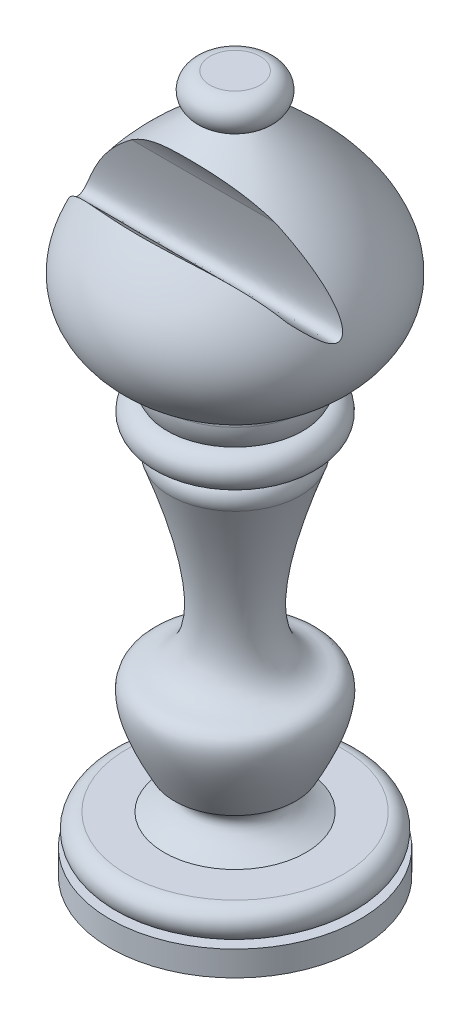
ISO-10303-21;
HEADER;
FILE_DESCRIPTION(('STEP AP214'),'2;1');
FILE_NAME('part.step','',(''),(''),'','','');
FILE_SCHEMA(('AUTOMOTIVE_DESIGN { 1 0 10303 214 1 1 1 1 }'));
ENDSEC;
DATA;
#1=APPLICATION_CONTEXT('core data for automotive mechanical design processes');
#2=APPLICATION_PROTOCOL_DEFINITION('international standard','automotive_design',2000,#1);
#3=PRODUCT_CONTEXT('',#1,'mechanical');
#4=PRODUCT('Part','Part','',(#3));
#5=PRODUCT_RELATED_PRODUCT_CATEGORY('part','',(#4));
#6=PRODUCT_DEFINITION_FORMATION('','',#4);
#7=PRODUCT_DEFINITION_CONTEXT('part definition',#1,'design');
#8=PRODUCT_DEFINITION('design','',#6,#7);
#9=PRODUCT_DEFINITION_SHAPE('','',#8);
#10=(LENGTH_UNIT() NAMED_UNIT(*) SI_UNIT(.MILLI.,.METRE.));
#11=(NAMED_UNIT(*) PLANE_ANGLE_UNIT() SI_UNIT($,.RADIAN.));
#12=(NAMED_UNIT(*) SI_UNIT($,.STERADIAN.) SOLID_ANGLE_UNIT());
#13=UNCERTAINTY_MEASURE_WITH_UNIT(LENGTH_MEASURE(1.E-05),#10,'distance_accuracy_value','');
#14=(GEOMETRIC_REPRESENTATION_CONTEXT(3) GLOBAL_UNCERTAINTY_ASSIGNED_CONTEXT((#13)) GLOBAL_UNIT_ASSIGNED_CONTEXT((#10,
#11,#12)) REPRESENTATION_CONTEXT('',''));
#15=CARTESIAN_POINT('',(0.,0.,0.));
#16=DIRECTION('',(0.,0.,1.));
#17=DIRECTION('',(1.,0.,0.));
#18=AXIS2_PLACEMENT_3D('',#15,#16,#17);
#19=CARTESIAN_POINT('',(0.,3.,0.));
#20=DIRECTION('',(0.,-1.,0.));
#21=DIRECTION('',(0.,0.,-1.));
#22=AXIS2_PLACEMENT_3D('',#19,#20,#21);
#23=CYLINDRICAL_SURFACE('',#22,15.);
#24=CARTESIAN_POINT('',(0.,3.,0.));
#25=DIRECTION('',(0.,1.,0.));
#26=DIRECTION('',(0.,0.,1.));
#27=AXIS2_PLACEMENT_3D('',#24,#25,#26);
#28=CIRCLE('',#27,15.);
#29=CARTESIAN_POINT('',(0.,3.,15.));
#30=VERTEX_POINT('',#29);
#31=EDGE_CURVE('E178',#30,#30,#28,.T.);
#32=ORIENTED_EDGE('',*,*,#31,.F.);
#33=EDGE_LOOP('',(#32));
#34=FACE_BOUND('',#33,.T.);
#35=CARTESIAN_POINT('',(0.,0.,0.));
#36=DIRECTION('',(0.,1.,0.));
#37=DIRECTION('',(0.,0.,1.));
#38=AXIS2_PLACEMENT_3D('',#35,#36,#37);
#39=CIRCLE('',#38,15.);
#40=CARTESIAN_POINT('',(0.,0.,15.));
#41=VERTEX_POINT('',#40);
#42=EDGE_CURVE('E177',#41,#41,#39,.T.);
#43=ORIENTED_EDGE('',*,*,#42,.T.);
#44=EDGE_LOOP('',(#43));
#45=FACE_BOUND('',#44,.T.);
#46=ADVANCED_FACE('F36',(#34,#45),#23,.T.);
#47=CARTESIAN_POINT('',(0.,3.,0.));
#48=DIRECTION('',(0.,1.,0.));
#49=DIRECTION('',(0.,0.,1.));
#50=AXIS2_PLACEMENT_3D('',#47,#48,#49);
#51=PLANE('',#50);
#52=CARTESIAN_POINT('',(0.,3.,0.));
#53=DIRECTION('',(0.,-1.,0.));
#54=DIRECTION('',(1.,0.,0.));
#55=AXIS2_PLACEMENT_3D('',#52,#53,#54);
#56=CIRCLE('',#55,13.);
#57=CARTESIAN_POINT('',(13.,3.,0.));
#58=VERTEX_POINT('',#57);
#59=EDGE_CURVE('E165',#58,#58,#56,.T.);
#60=ORIENTED_EDGE('',*,*,#59,.T.);
#61=EDGE_LOOP('',(#60));
#62=FACE_BOUND('',#61,.T.);
#63=ORIENTED_EDGE('',*,*,#31,.T.);
#64=EDGE_LOOP('',(#63));
#65=FACE_BOUND('',#64,.T.);
#66=ADVANCED_FACE('F196',(#62,#65),#51,.T.);
#67=CARTESIAN_POINT('',(0.,0.,0.));
#68=DIRECTION('',(0.,1.,0.));
#69=DIRECTION('',(0.,0.,1.));
#70=AXIS2_PLACEMENT_3D('',#67,#68,#69);
#71=PLANE('',#70);
#72=ORIENTED_EDGE('',*,*,#42,.F.);
#73=EDGE_LOOP('',(#72));
#74=FACE_BOUND('',#73,.T.);
#75=ADVANCED_FACE('F193',(#74),#71,.F.);
#76=CARTESIAN_POINT('',(0.,4.83640551469907,0.));
#77=DIRECTION('',(0.,-1.,0.));
#78=DIRECTION('',(1.,0.,0.));
#79=AXIS2_PLACEMENT_3D('',#76,#77,#78);
#80=TOROIDAL_SURFACE('',#79,13.,1.83640551469907);
#81=CARTESIAN_POINT('',(0.,6.67281102939814,0.));
#82=DIRECTION('',(0.,-1.,0.));
#83=DIRECTION('',(1.,0.,0.));
#84=AXIS2_PLACEMENT_3D('',#81,#82,#83);
#85=CIRCLE('',#84,13.);
#86=CARTESIAN_POINT('',(13.,6.67281102939813,0.));
#87=VERTEX_POINT('',#86);
#88=EDGE_CURVE('E174',#87,#87,#85,.T.);
#89=ORIENTED_EDGE('',*,*,#88,.T.);
#90=EDGE_LOOP('',(#89));
#91=FACE_BOUND('',#90,.T.);
#92=ORIENTED_EDGE('',*,*,#59,.F.);
#93=EDGE_LOOP('',(#92));
#94=FACE_BOUND('',#93,.T.);
#95=ADVANCED_FACE('F195',(#91,#94),#80,.T.);
#96=CARTESIAN_POINT('',(13.,6.67281102939813,0.));
#97=DIRECTION('',(0.,1.,0.));
#98=DIRECTION('',(-1.,0.,0.));
#99=AXIS2_PLACEMENT_3D('',#96,#97,#98);
#100=PLANE('',#99);
#101=CARTESIAN_POINT('',(0.,6.67281102939813,0.));
#102=DIRECTION('',(0.,-1.,0.));
#103=DIRECTION('',(1.,0.,0.));
#104=AXIS2_PLACEMENT_3D('',#101,#102,#103);
#105=CIRCLE('',#104,8.49943361059358);
#106=CARTESIAN_POINT('',(8.49943361059358,6.67281102939813,0.));
#107=VERTEX_POINT('',#106);
#108=EDGE_CURVE('E171',#107,#107,#105,.T.);
#109=ORIENTED_EDGE('',*,*,#108,.T.);
#110=EDGE_LOOP('',(#109));
#111=FACE_BOUND('',#110,.T.);
#112=ORIENTED_EDGE('',*,*,#88,.F.);
#113=EDGE_LOOP('',(#112));
#114=FACE_BOUND('',#113,.T.);
#115=ADVANCED_FACE('F155',(#111,#114),#100,.T.);
#116=CARTESIAN_POINT('',(8.49943361059358,6.67281102939813,0.));
#117=CARTESIAN_POINT('',(2.78255118880664,9.10264856484603,0.));
#118=CARTESIAN_POINT('',(7.27414037229584,11.4072276424758,0.));
#119=B_SPLINE_CURVE_WITH_KNOTS('',2,(#116,#117,#118),.UNSPECIFIED.,.F.,.F.,(3,3),(0.,1.),.UNSPECIFIED.);
#120=CARTESIAN_POINT('',(0.,0.,0.));
#121=DIRECTION('',(0.,-1.,0.));
#122=AXIS1_PLACEMENT('',#120,#121);
#123=SURFACE_OF_REVOLUTION('',#119,#122);
#124=CARTESIAN_POINT('',(0.,11.4072276424758,0.));
#125=DIRECTION('',(0.,-1.,0.));
#126=DIRECTION('',(0.,0.,-1.));
#127=AXIS2_PLACEMENT_3D('',#124,#125,#126);
#128=CIRCLE('',#127,7.27414037229584);
#129=CARTESIAN_POINT('',(0.,11.4072276424758,-7.27414037229584));
#130=VERTEX_POINT('',#129);
#131=EDGE_CURVE('E163',#130,#130,#128,.T.);
#132=ORIENTED_EDGE('',*,*,#131,.T.);
#133=EDGE_LOOP('',(#132));
#134=FACE_BOUND('',#133,.T.);
#135=ORIENTED_EDGE('',*,*,#108,.F.);
#136=EDGE_LOOP('',(#135));
#137=FACE_BOUND('',#136,.T.);
#138=ADVANCED_FACE('F149',(#134,#137),#123,.F.);
#139=CARTESIAN_POINT('',(7.27414037229584,11.4072276424758,0.));
#140=CARTESIAN_POINT('',(12.4321611006904,20.9437745175261,0.));
#141=CARTESIAN_POINT('',(0.485845427921329,23.2013122271752,0.));
#142=CARTESIAN_POINT('',(7.82984573011213,43.4167765908085,0.));
#143=B_SPLINE_CURVE_WITH_KNOTS('',2,(#139,#140,#141,#142),.UNSPECIFIED.,.F.,.F.,(3,1,3),(0.,
0.339914942208554,1.),.UNSPECIFIED.);
#144=CARTESIAN_POINT('',(0.,0.,0.));
#145=DIRECTION('',(0.,-1.,0.));
#146=AXIS1_PLACEMENT('',#144,#145);
#147=SURFACE_OF_REVOLUTION('',#143,#146);
#148=CARTESIAN_POINT('',(0.,43.4167765908085,0.));
#149=DIRECTION('',(0.,-1.,0.));
#150=DIRECTION('',(0.,0.,-1.));
#151=AXIS2_PLACEMENT_3D('',#148,#149,#150);
#152=CIRCLE('',#151,7.82984573011214);
#153=CARTESIAN_POINT('',(0.,43.4167765908085,-7.82984573011214));
#154=VERTEX_POINT('',#153);
#155=EDGE_CURVE('E134',#154,#154,#152,.T.);
#156=ORIENTED_EDGE('',*,*,#155,.T.);
#157=EDGE_LOOP('',(#156));
#158=FACE_BOUND('',#157,.T.);
#159=ORIENTED_EDGE('',*,*,#131,.F.);
#160=EDGE_LOOP('',(#159));
#161=FACE_BOUND('',#160,.T.);
#162=ADVANCED_FACE('F144',(#158,#161),#147,.F.);
#163=CARTESIAN_POINT('',(0.,0.,0.));
#164=DIRECTION('',(0.,-1.,0.));
#165=DIRECTION('',(0.,0.,-1.));
#166=AXIS2_PLACEMENT_3D('',#163,#164,#165);
#167=CYLINDRICAL_SURFACE('',#166,8.82393962345572);
#168=CARTESIAN_POINT('',(0.,52.8435958869309,0.));
#169=DIRECTION('',(0.,-1.,0.));
#170=DIRECTION('',(0.,0.,-1.));
#171=AXIS2_PLACEMENT_3D('',#168,#169,#170);
#172=CIRCLE('',#171,8.82393962345572);
#173=CARTESIAN_POINT('',(0.,52.8435958869309,-8.82393962345572));
#174=VERTEX_POINT('',#173);
#175=EDGE_CURVE('E44',#174,#174,#172,.F.);
#176=ORIENTED_EDGE('',*,*,#175,.T.);
#177=EDGE_LOOP('',(#176));
#178=FACE_BOUND('',#177,.T.);
#179=CARTESIAN_POINT('',(0.,53.2850113292567,0.));
#180=DIRECTION('',(0.,-1.,0.));
#181=DIRECTION('',(0.,0.,-1.));
#182=AXIS2_PLACEMENT_3D('',#179,#180,#181);
#183=CIRCLE('',#182,8.82393962345572);
#184=CARTESIAN_POINT('',(0.,53.2850113292567,-8.82393962345572));
#185=VERTEX_POINT('',#184);
#186=EDGE_CURVE('E73',#185,#185,#183,.T.);
#187=ORIENTED_EDGE('',*,*,#186,.T.);
#188=EDGE_LOOP('',(#187));
#189=FACE_BOUND('',#188,.T.);
#190=ADVANCED_FACE('F148',(#178,#189),#167,.T.);
#191=CARTESIAN_POINT('',(0.,48.2960300306177,0.));
#192=DIRECTION('',(0.,-1.,0.));
#193=DIRECTION('',(0.,0.,-1.));
#194=AXIS2_PLACEMENT_3D('',#191,#192,#193);
#195=TOROIDAL_SURFACE('',#194,8.12625390855244,2.00000000000001);
#196=CARTESIAN_POINT('',(0.,50.2960300306177,0.));
#197=DIRECTION('',(0.,-1.,0.));
#198=DIRECTION('',(0.,0.,-1.));
#199=AXIS2_PLACEMENT_3D('',#196,#197,#198);
#200=CIRCLE('',#199,8.12625390855244);
#201=CARTESIAN_POINT('',(0.,50.2960300306177,-8.12625390855244));
#202=VERTEX_POINT('',#201);
#203=EDGE_CURVE('E371',#202,#202,#200,.T.);
#204=ORIENTED_EDGE('',*,*,#203,.T.);
#205=EDGE_LOOP('',(#204));
#206=FACE_BOUND('',#205,.T.);
#207=CARTESIAN_POINT('',(0.,46.2960300306177,0.));
#208=DIRECTION('',(0.,-1.,0.));
#209=DIRECTION('',(0.,0.,-1.));
#210=AXIS2_PLACEMENT_3D('',#207,#208,#209);
#211=CIRCLE('',#210,8.12625390855244);
#212=CARTESIAN_POINT('',(0.,46.2960300306177,-8.12625390855244));
#213=VERTEX_POINT('',#212);
#214=EDGE_CURVE('E372',#213,#213,#211,.T.);
#215=ORIENTED_EDGE('',*,*,#214,.F.);
#216=EDGE_LOOP('',(#215));
#217=FACE_BOUND('',#216,.T.);
#218=ADVANCED_FACE('F250',(#206,#217),#195,.T.);
#219=CARTESIAN_POINT('',(6.03348457806508,46.2960300306177,0.));
#220=DIRECTION('',(0.,-1.,0.));
#221=DIRECTION('',(0.,0.,-1.));
#222=AXIS2_PLACEMENT_3D('',#219,#220,#221);
#223=PLANE('',#222);
#224=ORIENTED_EDGE('',*,*,#214,.T.);
#225=EDGE_LOOP('',(#224));
#226=FACE_BOUND('',#225,.T.);
#227=CARTESIAN_POINT('',(0.,46.2960300306177,0.));
#228=DIRECTION('',(0.,-1.,0.));
#229=DIRECTION('',(0.,0.,-1.));
#230=AXIS2_PLACEMENT_3D('',#227,#228,#229);
#231=CIRCLE('',#230,6.03348457806508);
#232=CARTESIAN_POINT('',(0.,46.2960300306177,-6.03348457806508));
#233=VERTEX_POINT('',#232);
#234=EDGE_CURVE('E375',#233,#233,#231,.T.);
#235=ORIENTED_EDGE('',*,*,#234,.F.);
#236=EDGE_LOOP('',(#235));
#237=FACE_BOUND('',#236,.T.);
#238=ADVANCED_FACE('F256',(#226,#237),#223,.T.);
#239=CARTESIAN_POINT('',(0.,44.2960300306177,0.));
#240=DIRECTION('',(0.,-1.,0.));
#241=DIRECTION('',(0.,0.,-1.));
#242=AXIS2_PLACEMENT_3D('',#239,#240,#241);
#243=TOROIDAL_SURFACE('',#242,6.03348457806508,2.);
#244=ORIENTED_EDGE('',*,*,#234,.T.);
#245=EDGE_LOOP('',(#244));
#246=FACE_BOUND('',#245,.T.);
#247=ORIENTED_EDGE('',*,*,#155,.F.);
#248=EDGE_LOOP('',(#247));
#249=FACE_BOUND('',#248,.T.);
#250=ADVANCED_FACE('F266',(#246,#249),#243,.T.);
#251=CARTESIAN_POINT('',(0.,53.2850113292567,-8.82393962345572));
#252=CARTESIAN_POINT('',(0.,63.283858911102,-26.7596708130507));
#253=CARTESIAN_POINT('',(0.,81.5387323526658,0.));
#254=B_SPLINE_CURVE_WITH_KNOTS('',2,(#251,#252,#253),.UNSPECIFIED.,.F.,.F.,(3,3),(0.,1.),.UNSPECIFIED.);
#255=CARTESIAN_POINT('',(0.,53.2850113292567,0.));
#256=DIRECTION('',(0.,-1.,0.));
#257=AXIS1_PLACEMENT('',#255,#256);
#258=SURFACE_OF_REVOLUTION('',#254,#257);
#259=CARTESIAN_POINT('',(0.,79.6703288943434,0.));
#260=DIRECTION('',(0.,-1.,0.));
#261=DIRECTION('',(0.,0.,-1.));
#262=AXIS2_PLACEMENT_3D('',#259,#260,#261);
#263=CIRCLE('',#262,2.65148413658831);
#264=CARTESIAN_POINT('',(0.,79.6703288943434,-2.65148413658831));
#265=VERTEX_POINT('',#264);
#266=EDGE_CURVE('E11',#265,#265,#263,.F.);
#267=ORIENTED_EDGE('',*,*,#266,.F.);
#268=EDGE_LOOP('',(#267));
#269=FACE_BOUND('',#268,.T.);
#270=CARTESIAN_POINT('',(-8.60792510163417,74.0978234508581,3.80757069284475));
#271=CARTESIAN_POINT('',(-8.72442885410751,74.005631653139,3.78175795430837));
#272=CARTESIAN_POINT('',(-8.84020421720979,73.9125479341612,3.7558445667934));
#273=CARTESIAN_POINT('',(-9.07028086226353,73.724622452141,3.7038579505274));
#274=CARTESIAN_POINT('',(-9.18458215942401,73.6297807072621,3.67778472342965));
#275=CARTESIAN_POINT('',(-9.4116950107282,73.4383637126611,3.62551952624832));
#276=CARTESIAN_POINT('',(-9.52450657491791,73.3417884746392,3.59932755696707));
#277=CARTESIAN_POINT('',(-9.7493515199577,73.1462738106939,3.54669371530906));
#278=CARTESIAN_POINT('',(-9.86137488571513,73.0473230047954,3.52025133302029));
#279=CARTESIAN_POINT('',(-10.0838515317509,72.8476777153758,3.46733199261382));
#280=CARTESIAN_POINT('',(-10.1943047970652,72.7469832152566,3.44085503416921));
#281=CARTESIAN_POINT('',(-10.4135957924079,72.5438434589893,3.38791361101796));
#282=CARTESIAN_POINT('',(-10.5224334786861,72.4413981555903,3.36144914666838));
#283=CARTESIAN_POINT('',(-10.8622619957894,72.1162848789113,3.27827676291813));
#284=CARTESIAN_POINT('',(-11.0902508446968,71.8904308762382,3.22167828300116));
#285=CARTESIAN_POINT('',(-11.5378891370659,71.4302960999678,3.10933862263057));
#286=CARTESIAN_POINT('',(-11.7575367365424,71.1960134851082,3.05359763334255));
#287=CARTESIAN_POINT('',(-12.1876324529455,70.7184815218298,2.94372832184705));
#288=CARTESIAN_POINT('',(-12.3980746624152,70.4752265948434,2.88960104211313));
#289=CARTESIAN_POINT('',(-12.8076284904951,69.9801728278719,2.7843035864601));
#290=CARTESIAN_POINT('',(-13.0067767181597,69.7284063838464,2.73312384668777));
#291=CARTESIAN_POINT('',(-13.392789251236,69.2149138504356,2.63520909167128));
#292=CARTESIAN_POINT('',(-13.5796598659093,68.9531929873851,2.5884717879285));
#293=CARTESIAN_POINT('',(-13.8490166337107,68.5525864432176,2.52384691200866));
#294=CARTESIAN_POINT('',(-13.936937976498,68.4177796932854,2.50322734278037));
#295=CARTESIAN_POINT('',(-14.1088067868696,68.1453271802574,2.46436498489935));
#296=CARTESIAN_POINT('',(-14.1927547101867,68.0076817453582,2.44612192324961));
#297=CARTESIAN_POINT('',(-14.3403834132286,67.7564381388699,2.41600168081937));
#298=CARTESIAN_POINT('',(-14.4048350562705,67.6433587963072,2.40357620197817));
#299=CARTESIAN_POINT('',(-14.5306197622909,67.4152029991069,2.38130906074969));
#300=CARTESIAN_POINT('',(-14.5919525020299,67.3001263391206,2.3714676657355));
#301=CARTESIAN_POINT('',(-14.7110917174099,67.0680816776525,2.35514855293456));
#302=CARTESIAN_POINT('',(-14.7689020410864,66.9511159233316,2.34866710427529));
#303=CARTESIAN_POINT('',(-14.8806386869285,66.7151915711022,2.34015546564201));
#304=CARTESIAN_POINT('',(-14.9345661745719,66.5962335845112,2.33812393454167));
#305=CARTESIAN_POINT('',(-15.0125179891717,66.4154395370067,2.33972939034757));
#306=CARTESIAN_POINT('',(-15.0382006491714,66.3542952417337,2.34106920814199));
#307=CARTESIAN_POINT('',(-15.0883070381997,66.2315673403049,2.34568528808538));
#308=CARTESIAN_POINT('',(-15.1127309101506,66.1699837849306,2.34896132986725));
#309=CARTESIAN_POINT('',(-15.1602118513219,66.0463900929013,2.35788290957969));
#310=CARTESIAN_POINT('',(-15.1832676111812,65.9843796090186,2.36353067693617));
#311=CARTESIAN_POINT('',(-15.227805785995,65.8601350093043,2.37777926670716));
#312=CARTESIAN_POINT('',(-15.2492886288766,65.7979009591658,2.38637928228494));
#313=CARTESIAN_POINT('',(-15.2837679564817,65.6936105688696,2.40395847266603));
#314=CARTESIAN_POINT('',(-15.2972598084872,65.6515461346667,2.41191306764712));
#315=CARTESIAN_POINT('',(-15.3232978177225,65.5675709113722,2.42989209936333));
#316=CARTESIAN_POINT('',(-15.3358442106962,65.5256600864753,2.43991601777969));
#317=CARTESIAN_POINT('',(-15.3598279232019,65.4422647673878,2.46245050727852));
#318=CARTESIAN_POINT('',(-15.3712671667726,65.4007796498197,2.47495664490577));
#319=CARTESIAN_POINT('',(-15.392853234021,65.3185250185999,2.5030168941858));
#320=CARTESIAN_POINT('',(-15.4030009595538,65.2777550229281,2.51856885948448));
#321=CARTESIAN_POINT('',(-15.4223908289694,65.1946280101569,2.55465035259437));
#322=CARTESIAN_POINT('',(-15.4315196890511,65.1523599744341,2.57545230871912));
#323=CARTESIAN_POINT('',(-15.4474945565152,65.0703787084963,2.6223736884158));
#324=CARTESIAN_POINT('',(-15.4543429582629,65.0306628342372,2.6484874881046));
#325=CARTESIAN_POINT('',(-15.4641034008734,64.9626761974068,2.70147299569622));
#326=CARTESIAN_POINT('',(-15.4675136214293,64.933657969303,2.72727774376412));
#327=CARTESIAN_POINT('',(-15.4720392748044,64.8798846643474,2.7831706018691));
#328=CARTESIAN_POINT('',(-15.4731582942772,64.8551229800448,2.813251938244));
#329=CARTESIAN_POINT('',(-15.4728711462349,64.8110309599236,2.87749909505793));
#330=CARTESIAN_POINT('',(-15.4714473171115,64.7917396987633,2.91169193262561));
#331=CARTESIAN_POINT('',(-15.4660921671221,64.7596382605758,2.98282342703794));
#332=CARTESIAN_POINT('',(-15.4621589594448,64.7468329733852,3.0197641315348));
#333=CARTESIAN_POINT('',(-15.4515179205756,64.7264244310221,3.09950292783943));
#334=CARTESIAN_POINT('',(-15.4445313733679,64.7196407148634,3.14246794199557));
#335=CARTESIAN_POINT('',(-15.4284610521006,64.7128754875067,3.22852237836374));
#336=CARTESIAN_POINT('',(-15.4193738249493,64.7129052568744,3.27161188877752));
#337=CARTESIAN_POINT('',(-15.4013386615881,64.7178579319187,3.34971095193057));
#338=CARTESIAN_POINT('',(-15.3926333326818,64.7219420747691,3.38484061164093));
#339=CARTESIAN_POINT('',(-15.3743673133588,64.7330733022991,3.4544154784901));
#340=CARTESIAN_POINT('',(-15.3648059967464,64.7401225702831,3.48886016164917));
#341=CARTESIAN_POINT('',(-15.3449654974272,64.7566193918004,3.55705255749627));
#342=CARTESIAN_POINT('',(-15.3346844362427,64.7660734045395,3.5907981240765));
#343=CARTESIAN_POINT('',(-15.3135413703151,64.7869089757564,3.6574817698678));
#344=CARTESIAN_POINT('',(-15.3026795316141,64.7982899853076,3.69042007598573));
#345=CARTESIAN_POINT('',(-15.2699931566106,64.8340603410383,3.78616844024638));
#346=CARTESIAN_POINT('',(-15.2474681357549,64.8606151159589,3.84793017212712));
#347=CARTESIAN_POINT('',(-15.2008410692561,64.9178282293605,3.96899403970514));
#348=CARTESIAN_POINT('',(-15.1767362943448,64.9484937707264,4.02829161321123));
#349=CARTESIAN_POINT('',(-15.1271472871379,65.0127924975459,4.14471989432258));
#350=CARTESIAN_POINT('',(-15.1016618962052,65.0464281909951,4.20184871129547));
#351=CARTESIAN_POINT('',(-15.0491978911645,65.1162087162706,4.31470647389394));
#352=CARTESIAN_POINT('',(-15.0222073207913,65.1523744803937,4.37041679012676));
#353=CARTESIAN_POINT('',(-14.9670661212975,65.226337112333,4.48004217161833));
#354=CARTESIAN_POINT('',(-14.9389168213853,65.2641321134378,4.53395917231663));
#355=CARTESIAN_POINT('',(-14.8814940734997,65.340985341291,4.64023450115512));
#356=CARTESIAN_POINT('',(-14.8522209995184,65.3800431471068,4.69259333772927));
#357=CARTESIAN_POINT('',(-14.7745793252497,65.4830124859142,4.82712278249575));
#358=CARTESIAN_POINT('',(-14.7253511079955,65.5476939021984,4.90820905947476));
#359=CARTESIAN_POINT('',(-14.6241887883338,65.6787382763479,5.06736017735435));
#360=CARTESIAN_POINT('',(-14.5722530520766,65.7451022368411,5.145423143146));
#361=CARTESIAN_POINT('',(-14.4657576206099,65.8789491304198,5.29890742237179));
#362=CARTESIAN_POINT('',(-14.4111955306331,65.9464330465171,5.37432621220892));
#363=CARTESIAN_POINT('',(-14.2995400912851,66.082084437904,5.52278089933074));
#364=CARTESIAN_POINT('',(-14.2424446384548,66.1502524434338,5.5958147256141));
#365=CARTESIAN_POINT('',(-14.1258223216752,66.2869282984815,5.73968352957381));
#366=CARTESIAN_POINT('',(-14.0662941816696,66.3554363093572,5.81051731803603));
#367=CARTESIAN_POINT('',(-13.948232977937,66.4887627531436,5.94630226711074));
#368=CARTESIAN_POINT('',(-13.8898230719033,66.5535783857986,6.01136344361497));
#369=CARTESIAN_POINT('',(-13.7710266535849,66.6830580042002,6.13972019550286));
#370=CARTESIAN_POINT('',(-13.7106410966698,66.7477220475013,6.20301659763659));
#371=CARTESIAN_POINT('',(-13.588002766337,66.8767181688121,6.3279002030089));
#372=CARTESIAN_POINT('',(-13.5257522135908,66.9410505424704,6.38948928305912));
#373=CARTESIAN_POINT('',(-13.3994998368498,67.0692230764022,6.5110000536897));
#374=CARTESIAN_POINT('',(-13.3355015317719,67.1330639354803,6.57092466598778));
#375=CARTESIAN_POINT('',(-13.2058750744465,67.2601136592446,6.68913411960582));
#376=CARTESIAN_POINT('',(-13.140251746192,67.3233237586074,6.74742292266363));
#377=CARTESIAN_POINT('',(-13.0737609589204,67.3862588271674,6.80500766579694));
#378=B_SPLINE_CURVE_WITH_KNOTS('',3,(#270,#271,#272,#273,#274,#275,#276,#277,#278,#279,#280,
#281,#282,#283,#284,#285,#286,#287,#288,#289,#290,#291,#292,#293,#294,#295,#296,#297,#298,#299,
#300,#301,#302,#303,#304,#305,#306,#307,#308,#309,#310,#311,#312,#313,#314,#315,#316,#317,#318,
#319,#320,#321,#322,#323,#324,#325,#326,#327,#328,#329,#330,#331,#332,#333,#334,#335,#336,#337,
#338,#339,#340,#341,#342,#343,#344,#345,#346,#347,#348,#349,#350,#351,#352,#353,#354,#355,#356,
#357,#358,#359,#360,#361,#362,#363,#364,#365,#366,#367,#368,#369,#370,#371,#372,#373,#374,#375,
#376,#377),.UNSPECIFIED.,.F.,.F.,(4,2,2,2,2,2,2,2,2,2,2,2,2,2,2,2,2,2,2,2,2,2,2,2,2,2,2,2,2,2,2,
2,2,2,2,2,2,2,2,2,2,2,2,2,2,2,2,2,2,2,2,2,2,4),(0.,0.452376416493641,0.9047481617432,
1.35711685486824,1.81246419500167,2.26781587198794,2.72317985756403,3.70057408930474,
4.67818314874248,5.65641064006031,6.63126093868958,7.60560629503966,8.09231422189479,
8.57896618966111,8.97114845888386,9.36337129091746,9.7551576621578,10.1468259396704,
10.3457914183323,10.544734256533,10.743864521412,10.942940408116,11.0775512710063,
11.2121284577383,11.3464674067754,11.4807120273786,11.6243635343158,11.767863735368,
11.8843654600813,12.0006846727552,12.1178149367047,12.2350333753083,12.3664720964471,
12.4981284321722,12.6072402260587,12.7164325030403,12.8259212288356,12.9353788178563,
13.1478066838804,13.3606117536799,13.5735982664781,13.7886231018021,14.0034077989952,
14.2181216251936,14.5624538596058,14.906996342006,15.2518591677699,15.5970138980097,
15.9423520620095,16.2688331346735,16.5951585982078,16.9211098428393,17.2464472306585,
17.5709133176962),.UNSPECIFIED.);
#379=CARTESIAN_POINT('',(-8.60792510163417,74.0978234508581,3.80757069284475));
#380=VERTEX_POINT('',#379);
#381=CARTESIAN_POINT('',(-13.0737609589204,67.3862588271674,6.80500766579693));
#382=VERTEX_POINT('',#381);
#383=EDGE_CURVE('E56',#380,#382,#378,.T.);
#384=ORIENTED_EDGE('',*,*,#383,.F.);
#385=CARTESIAN_POINT('',(8.60792510163418,74.0978234508581,3.80757069284475));
#386=CARTESIAN_POINT('',(8.43284397121735,74.2299785570064,3.8627505302458));
#387=CARTESIAN_POINT('',(8.25601238036122,74.3594406328421,3.91886000748621));
#388=CARTESIAN_POINT('',(7.89872766591212,74.612619975719,4.0324766052885));
#389=CARTESIAN_POINT('',(7.71827458253489,74.7363373065038,4.08998371033157));
#390=CARTESIAN_POINT('',(7.35199024516639,74.9787515464822,4.20645415932841));
#391=CARTESIAN_POINT('',(7.16612530744416,75.0973935998752,4.26542593092198));
#392=CARTESIAN_POINT('',(6.79038130313013,75.3280220937698,4.38372306402257));
#393=CARTESIAN_POINT('',(6.60050173105149,75.4400076893022,4.44304846937258));
#394=CARTESIAN_POINT('',(6.20278823175799,75.6645444094869,4.5655596103028));
#395=CARTESIAN_POINT('',(5.99464280847353,75.7765609097588,4.6287173059546));
#396=CARTESIAN_POINT('',(5.57325668159261,75.9915743151181,4.75353458741083));
#397=CARTESIAN_POINT('',(5.36001537132432,76.0945701394048,4.81519399306182));
#398=CARTESIAN_POINT('',(4.92818763379163,76.2906884093529,4.93575954043665));
#399=CARTESIAN_POINT('',(4.7095998591395,76.3838083339248,4.99466497699998));
#400=CARTESIAN_POINT('',(4.2678239012328,76.5588643164296,5.1080501930897));
#401=CARTESIAN_POINT('',(4.04465553247566,76.6408401426931,5.16254541292912));
#402=CARTESIAN_POINT('',(3.59303854846398,76.7929794876976,5.2657619783578));
#403=CARTESIAN_POINT('',(3.36459095955659,76.8631452808484,5.31448443514584));
#404=CARTESIAN_POINT('',(2.90278036495318,76.9906187899976,5.4044978084359));
#405=CARTESIAN_POINT('',(2.66941951103743,77.0479320117585,5.4457919055804));
#406=CARTESIAN_POINT('',(2.17696769892425,77.1533110658224,5.52269600322362));
#407=CARTESIAN_POINT('',(1.91745919993586,77.2000708970604,5.55745358336898));
#408=CARTESIAN_POINT('',(1.39452689107434,77.2760562277368,5.61442825472059));
#409=CARTESIAN_POINT('',(1.13110357898712,77.3052839372411,5.63664692653689));
#410=CARTESIAN_POINT('',(0.602618751474141,77.3454082312788,5.66724894861914));
#411=CARTESIAN_POINT('',(0.33756202139404,77.3563443913198,5.67566216754702));
#412=CARTESIAN_POINT('',(-0.192743959724956,77.3597066480507,5.67824289357984));
#413=CARTESIAN_POINT('',(-0.457993213407942,77.3521324855228,5.6724102011856));
#414=CARTESIAN_POINT('',(-0.985596878579453,77.3187496373759,5.64689985118999));
#415=CARTESIAN_POINT('',(-1.24795858803873,77.293013139715,5.62727700517183));
#416=CARTESIAN_POINT('',(-1.76908221641698,77.2240572093625,5.57536666496847));
#417=CARTESIAN_POINT('',(-2.02784398245967,77.1808370365338,5.54307863462931));
#418=CARTESIAN_POINT('',(-2.54216593574304,77.077589094975,5.46727637029504));
#419=CARTESIAN_POINT('',(-2.79769193417141,77.0174479430056,5.42368656615933));
#420=CARTESIAN_POINT('',(-3.30282175436926,76.8817569078956,5.32745305711951));
#421=CARTESIAN_POINT('',(-3.5524256580166,76.8062072379294,5.27480947747445));
#422=CARTESIAN_POINT('',(-4.09423648237117,76.6246425840027,5.15147496269943));
#423=CARTESIAN_POINT('',(-4.38506677187533,76.5155570758453,5.07927582096298));
#424=CARTESIAN_POINT('',(-4.9578168943417,76.2793316229543,4.92838242367659));
#425=CARTESIAN_POINT('',(-5.23972802525947,76.1521746727958,4.84968207997126));
#426=CARTESIAN_POINT('',(-5.79510463539742,75.8817491812865,4.68877863162563));
#427=CARTESIAN_POINT('',(-6.06855904946477,75.7384605824814,4.60657124708898));
#428=CARTESIAN_POINT('',(-6.60183125375375,75.4406572276114,4.44289165304384));
#429=CARTESIAN_POINT('',(-6.86181222284604,75.2864232376967,4.36143746176762));
#430=CARTESIAN_POINT('',(-7.3739957428886,74.9658796880119,4.19961904248277));
#431=CARTESIAN_POINT('',(-7.62620907846634,74.7995880557791,4.11925339890306));
#432=CARTESIAN_POINT('',(-7.99879894492653,74.5421006453675,4.00064954387107));
#433=CARTESIAN_POINT('',(-8.12181282275729,74.4551022792378,3.96151136501663));
#434=CARTESIAN_POINT('',(-8.36613598027292,74.2784386870555,3.88396265650808));
#435=CARTESIAN_POINT('',(-8.48744532464635,74.1887735626134,3.84555209922072));
#436=CARTESIAN_POINT('',(-8.60792510163417,74.0978234508581,3.80757069284475));
#437=B_SPLINE_CURVE_WITH_KNOTS('',3,(#385,#386,#387,#388,#389,#390,#391,#392,#393,#394,#395,
#396,#397,#398,#399,#400,#401,#402,#403,#404,#405,#406,#407,#408,#409,#410,#411,#412,#413,#414,
#415,#416,#417,#418,#419,#420,#421,#422,#423,#424,#425,#426,#427,#428,#429,#430,#431,#432,#433,
#434,#435,#436),.UNSPECIFIED.,.F.,.F.,(4,2,2,2,2,2,2,2,2,2,2,2,2,2,2,2,2,2,2,2,2,2,2,2,2,4),(0.,
0.678565960963647,1.35712439078817,2.04175713400759,2.72647659955412,3.46026689747825,
4.19414499361147,4.9282099832482,5.65958250890264,6.39081402320103,7.121731692868,
7.91878633640276,8.71574048361575,9.51096810356457,10.3062068599141,11.0983025359271,
11.8904317472652,12.688000683593,13.4855585864351,14.4414087827311,15.3981644745518,
16.3561231777533,17.2949833222699,18.232475096552,18.69945446406,19.1664160611558),.UNSPECIFIED.);
#438=CARTESIAN_POINT('',(8.60792510163418,74.0978234508581,3.80757069284475));
#439=VERTEX_POINT('',#438);
#440=EDGE_CURVE('E64',#439,#380,#437,.T.);
#441=ORIENTED_EDGE('',*,*,#440,.F.);
#442=CARTESIAN_POINT('',(13.0737609589204,67.3862588271674,6.80500766579693));
#443=CARTESIAN_POINT('',(13.1501290055739,67.3139760941144,6.73886733609104));
#444=CARTESIAN_POINT('',(13.2253530608905,67.2413282669584,6.67179979521253));
#445=CARTESIAN_POINT('',(13.3735782745329,67.0952916289986,6.53556565889846));
#446=CARTESIAN_POINT('',(13.4465744405225,67.021901583792,6.46639495657567));
#447=CARTESIAN_POINT('',(13.5901793473119,66.8745802510871,6.32589692842643));
#448=CARTESIAN_POINT('',(13.6607849269248,66.8006483930086,6.25456696646228));
#449=CARTESIAN_POINT('',(13.7994518523757,66.6524807753228,6.10966546381497));
#450=CARTESIAN_POINT('',(13.8675118048406,66.5782448732615,6.03609273438914));
#451=CARTESIAN_POINT('',(14.0046110077629,66.4256593930249,5.88247851755304));
#452=CARTESIAN_POINT('',(14.0734988224562,66.3473077627251,5.80230366059819));
#453=CARTESIAN_POINT('',(14.208127565719,66.190952181246,5.63913281930465));
#454=CARTESIAN_POINT('',(14.273870163428,66.112948066032,5.5561383722053));
#455=CARTESIAN_POINT('',(14.4020658206539,65.9577703244205,5.38705197248451));
#456=CARTESIAN_POINT('',(14.464521482758,65.8805960806676,5.30096256420636));
#457=CARTESIAN_POINT('',(14.5860180782984,65.7276986823015,5.12528142491186));
#458=CARTESIAN_POINT('',(14.6450614353706,65.6519745239559,5.03569225736979));
#459=CARTESIAN_POINT('',(14.739910348019,65.528509028894,4.88392965062332));
#460=CARTESIAN_POINT('',(14.7767230785358,65.4801020434039,4.82292618297961));
#461=CARTESIAN_POINT('',(14.8487888140364,65.3846466627233,4.69890824998127));
#462=CARTESIAN_POINT('',(14.8840411462891,65.337598856491,4.63589293703349));
#463=CARTESIAN_POINT('',(14.9529496236526,65.2453224369827,4.50751335283565));
#464=CARTESIAN_POINT('',(14.9866032659534,65.2000966920019,4.44214566289245));
#465=CARTESIAN_POINT('',(15.0516995620949,65.112883663006,4.30973189950585));
#466=CARTESIAN_POINT('',(15.0831665526514,65.0708599374388,4.24272207744063));
#467=CARTESIAN_POINT('',(15.1442055399336,64.9904684515429,4.10581808408209));
#468=CARTESIAN_POINT('',(15.1737797526677,64.9520963893285,4.03592744929988));
#469=CARTESIAN_POINT('',(15.230758211947,64.8806578413212,3.89277419726896));
#470=CARTESIAN_POINT('',(15.2581675739088,64.8475786465295,3.81952021784206));
#471=CARTESIAN_POINT('',(15.2935658718867,64.8081566594451,3.71735885123359));
#472=CARTESIAN_POINT('',(15.3027142923354,64.7982944039996,3.69020913866419));
#473=CARTESIAN_POINT('',(15.3206302811216,64.7798020499648,3.63536872957012));
#474=CARTESIAN_POINT('',(15.3293977941209,64.7711721299955,3.60767795528159));
#475=CARTESIAN_POINT('',(15.3550623145198,64.7474526745748,3.5237483860715));
#476=CARTESIAN_POINT('',(15.3713228400488,64.7345316789717,3.4666479606657));
#477=CARTESIAN_POINT('',(15.3985646852986,64.718723345999,3.36161334638509));
#478=CARTESIAN_POINT('',(15.409960860805,64.7143894704711,3.31401516657816));
#479=CARTESIAN_POINT('',(15.4305761905729,64.7130849716312,3.21821836948911));
#480=CARTESIAN_POINT('',(15.4398000837254,64.7160981542502,3.1700213052971));
#481=CARTESIAN_POINT('',(15.4532704201367,64.7294464716261,3.08685967662207));
#482=CARTESIAN_POINT('',(15.4581868608921,64.7377000261316,3.05167879591334));
#483=CARTESIAN_POINT('',(15.4660221138955,64.7598157020889,2.98290193271694));
#484=CARTESIAN_POINT('',(15.4689434746734,64.7736706321288,2.94930397948569));
#485=CARTESIAN_POINT('',(15.472587163986,64.8068848757609,2.88472761915764));
#486=CARTESIAN_POINT('',(15.4733049179947,64.8262555487228,2.85375479097638));
#487=CARTESIAN_POINT('',(15.4725546212068,64.869676729724,2.79530685238391));
#488=CARTESIAN_POINT('',(15.4710841222665,64.8937324530612,2.76783569686958));
#489=CARTESIAN_POINT('',(15.4654022614623,64.9535076132182,2.70862131288139));
#490=CARTESIAN_POINT('',(15.4604733873503,64.9905140930876,2.6782585709727));
#491=CARTESIAN_POINT('',(15.4478886063415,65.0683450057146,2.62347961007254));
#492=CARTESIAN_POINT('',(15.4402223178055,65.1091835307478,2.59908663326177));
#493=CARTESIAN_POINT('',(15.423767841863,65.1882099184612,2.55780786897379));
#494=CARTESIAN_POINT('',(15.4152061308901,65.2261716556228,2.54038398962606));
#495=CARTESIAN_POINT('',(15.3967442614456,65.3030244297301,2.50880806031978));
#496=CARTESIAN_POINT('',(15.3868461428127,65.3419139774417,2.49465111136969));
#497=CARTESIAN_POINT('',(15.3658935556243,65.4203767190692,2.46895469355183));
#498=CARTESIAN_POINT('',(15.3548354164055,65.459951730793,2.45742392340258));
#499=CARTESIAN_POINT('',(15.331750482753,65.5394051551071,2.43657204650604));
#500=CARTESIAN_POINT('',(15.319723369325,65.5792836636663,2.42725167145381));
#501=CARTESIAN_POINT('',(15.2882844438092,65.6801462374144,2.40603887200525));
#502=CARTESIAN_POINT('',(15.2683126120955,65.7412113892601,2.39536776491472));
#503=CARTESIAN_POINT('',(15.2267073740785,65.8632765232263,2.37733543792023));
#504=CARTESIAN_POINT('',(15.2050731067814,65.9242764547601,2.369975946851));
#505=CARTESIAN_POINT('',(15.1603249951407,66.0460883262671,2.35788218246331));
#506=CARTESIAN_POINT('',(15.1372090327953,66.1068998607275,2.35315176500353));
#507=CARTESIAN_POINT('',(15.0896753818443,66.228146051464,2.34583389022162));
#508=CARTESIAN_POINT('',(15.0652574707793,66.2885806413497,2.34324680037939));
#509=CARTESIAN_POINT('',(14.9900033958872,66.46977002946,2.33810102069468));
#510=CARTESIAN_POINT('',(14.9373717831105,66.5898574908366,2.3382051191115));
#511=CARTESIAN_POINT('',(14.8280897431104,66.8278913691929,2.34340329017362));
#512=CARTESIAN_POINT('',(14.771443278697,66.9458397569567,2.34849250423577));
#513=CARTESIAN_POINT('',(14.6514172416877,67.1859671966196,2.36274415973258));
#514=CARTESIAN_POINT('',(14.5878395584929,67.308034669749,2.37211008738034));
#515=CARTESIAN_POINT('',(14.4570971720716,67.5499630705997,2.39393602852542));
#516=CARTESIAN_POINT('',(14.3899319053336,67.6698236476784,2.40639652922421));
#517=CARTESIAN_POINT('',(14.2522473813083,67.9075737572186,2.4337308403048));
#518=CARTESIAN_POINT('',(14.1817229677819,68.0254598577963,2.4486084512039));
#519=CARTESIAN_POINT('',(14.0376935395172,68.2591428018576,2.48025592467446));
#520=CARTESIAN_POINT('',(13.9641883011059,68.3749394876117,2.4970259294149));
#521=CARTESIAN_POINT('',(13.7394695591091,68.7194513830851,2.54960257990548));
#522=CARTESIAN_POINT('',(13.5841355454594,68.9451471415955,2.58765859110482));
#523=CARTESIAN_POINT('',(13.2637473227113,69.3894270046827,2.66773631119015));
#524=CARTESIAN_POINT('',(13.0986747771916,69.6079964072625,2.7097655970442));
#525=CARTESIAN_POINT('',(12.7604034397892,70.0378763481219,2.79639259099374));
#526=CARTESIAN_POINT('',(12.587212299668,70.2491934087509,2.84098788930098));
#527=CARTESIAN_POINT('',(12.2335247449752,70.665147668259,2.93188570554857));
#528=CARTESIAN_POINT('',(12.0530299676568,70.8697863458501,2.9781878406632));
#529=CARTESIAN_POINT('',(11.7433676805744,71.2092427962437,3.05711666545191));
#530=CARTESIAN_POINT('',(11.615955090557,71.345736170921,3.0894534590921));
#531=CARTESIAN_POINT('',(11.3581981862757,71.6158691445449,3.15449004244626));
#532=CARTESIAN_POINT('',(11.2278535422025,71.7495084191215,3.18718987278444));
#533=CARTESIAN_POINT('',(10.9643922170776,72.0139994132555,3.25282075834809));
#534=CARTESIAN_POINT('',(10.8312751974825,72.1448507883798,3.28575184148324));
#535=CARTESIAN_POINT('',(10.5624054369442,72.403809076252,3.3517318786975));
#536=CARTESIAN_POINT('',(10.426652478123,72.5319157602761,3.38478084233431));
#537=CARTESIAN_POINT('',(10.1541945420568,72.7839554653741,3.45051720190019));
#538=CARTESIAN_POINT('',(10.0175181487574,72.9079194447697,3.48320441607936));
#539=CARTESIAN_POINT('',(9.74179851387689,73.1531818171769,3.54850488368179));
#540=CARTESIAN_POINT('',(9.60275547246536,73.2744804336548,3.58111814309828));
#541=CARTESIAN_POINT('',(9.32238271251057,73.514387047911,3.6461851214441));
#542=CARTESIAN_POINT('',(9.18105348060211,73.6329956057086,3.6786388724574));
#543=CARTESIAN_POINT('',(8.89616429401367,73.8674674246782,3.74330368022868));
#544=CARTESIAN_POINT('',(8.7526051142697,73.9833316057147,3.77551481576552));
#545=CARTESIAN_POINT('',(8.60792510163418,74.0978234508581,3.80757069284475));
#546=B_SPLINE_CURVE_WITH_KNOTS('',3,(#442,#443,#444,#445,#446,#447,#448,#449,#450,#451,#452,
#453,#454,#455,#456,#457,#458,#459,#460,#461,#462,#463,#464,#465,#466,#467,#468,#469,#470,#471,
#472,#473,#474,#475,#476,#477,#478,#479,#480,#481,#482,#483,#484,#485,#486,#487,#488,#489,#490,
#491,#492,#493,#494,#495,#496,#497,#498,#499,#500,#501,#502,#503,#504,#505,#506,#507,#508,#509,
#510,#511,#512,#513,#514,#515,#516,#517,#518,#519,#520,#521,#522,#523,#524,#525,#526,#527,#528,
#529,#530,#531,#532,#533,#534,#535,#536,#537,#538,#539,#540,#541,#542,#543,#544,#545),
.UNSPECIFIED.,.F.,.F.,(4,2,2,2,2,2,2,2,2,2,2,2,2,2,2,2,2,2,2,2,2,2,2,2,2,2,2,2,2,2,2,2,2,2,2,2,
2,2,2,2,2,2,2,2,2,2,2,2,2,2,2,4),(0.,0.372664687643418,0.746110872249406,1.12003299110398,
1.49415687070014,1.88882394452557,2.28327919426623,2.67741726537184,3.07127186431846,
3.32964786597313,3.58813419679885,3.84701269209948,4.10227117344394,4.35722512212733,
4.61155738942669,4.70242673619365,4.79330924060933,4.9750593982887,5.12204246155131,
5.26870184405844,5.37765619455607,5.48647110431629,5.5955117536288,5.70467448569289,
5.84822652776947,5.99232887619686,6.12005638886389,6.24759110212888,6.37554229764017,
6.50353578920465,6.69877400581464,6.89411402895082,7.08973979122515,7.28539908718105,
7.67848851432397,8.07119521025644,8.48492675626554,8.89872348042326,9.31317724469747,
9.72766216619766,10.5571249060658,11.3882026137414,12.2185121912512,13.0486366587324,
13.6170935252811,14.1856146571048,14.7542056246807,15.3228437918523,15.8849870612182,
16.4470830188102,17.0090608641463,17.570847600155),.UNSPECIFIED.);
#547=CARTESIAN_POINT('',(13.0737609589204,67.3862588271674,6.80500766579693));
#548=VERTEX_POINT('',#547);
#549=EDGE_CURVE('E70',#548,#439,#546,.T.);
#550=ORIENTED_EDGE('',*,*,#549,.F.);
#551=CARTESIAN_POINT('',(-13.0737609589204,67.3862588271674,6.80500766579693));
#552=CARTESIAN_POINT('',(-12.9176037713909,67.5541002833149,6.91785240500611));
#553=CARTESIAN_POINT('',(-12.7564040280496,67.7171451465821,7.03076805197786));
#554=CARTESIAN_POINT('',(-12.424792665027,68.0336503737409,7.25624047562006));
#555=CARTESIAN_POINT('',(-12.25438548367,68.1871152799738,7.3687973979833));
#556=CARTESIAN_POINT('',(-11.9049950979263,68.4847032996741,7.59321602439608));
#557=CARTESIAN_POINT('',(-11.7260076813323,68.62882174138,7.70507735588595));
#558=CARTESIAN_POINT('',(-11.3601116019476,68.9077530298349,7.92756821575875));
#559=CARTESIAN_POINT('',(-11.1732005450761,69.0425630312821,8.03819735890928));
#560=CARTESIAN_POINT('',(-10.6296876058474,69.4138074815766,8.35112237581984));
#561=CARTESIAN_POINT('',(-10.2641020131584,69.639041403737,8.55126853813872));
#562=CARTESIAN_POINT('',(-9.51030973641012,70.0583798455638,8.94151402646506));
#563=CARTESIAN_POINT('',(-9.12209498057062,70.2524731636497,9.13160972080881));
#564=CARTESIAN_POINT('',(-8.32457472909861,70.6104786131973,9.49759324082125));
#565=CARTESIAN_POINT('',(-7.91523301630269,70.7743365549298,9.67345524541718));
#566=CARTESIAN_POINT('',(-7.07829518278138,71.0722678585854,10.0057923517084));
#567=CARTESIAN_POINT('',(-6.65070110748067,71.2063445475097,10.1622696180975));
#568=CARTESIAN_POINT('',(-5.7769717561077,71.4464654346199,10.451932861408));
#569=CARTESIAN_POINT('',(-5.33074112254034,71.5523377066899,10.5849743876359));
#570=CARTESIAN_POINT('',(-4.42497021286159,71.7361034816032,10.8220831216123));
#571=CARTESIAN_POINT('',(-3.96542964008795,71.8139963603007,10.9261496829949));
#572=CARTESIAN_POINT('',(-3.03709301288245,71.9427528255012,11.1013647771823));
#573=CARTESIAN_POINT('',(-2.56831191715275,71.9936568852694,11.1725625801436));
#574=CARTESIAN_POINT('',(-1.6246478317344,72.069427069106,11.2795333517725));
#575=CARTESIAN_POINT('',(-1.14976534064233,72.0942953072536,11.3153091966501));
#576=CARTESIAN_POINT('',(-0.230259817670328,72.1176230150685,11.3488682275019));
#577=CARTESIAN_POINT('',(0.214235027907558,72.1177565340075,11.3490597669521));
#578=CARTESIAN_POINT('',(1.10151772948031,72.0957826687988,11.3174493270346));
#579=CARTESIAN_POINT('',(1.54430566046332,72.0736762731348,11.2856487695998));
#580=CARTESIAN_POINT('',(2.42506865693446,72.0068640617505,11.1911195726927));
#581=CARTESIAN_POINT('',(2.86304100726331,71.9621461038632,11.1283743166953));
#582=CARTESIAN_POINT('',(3.7308271107226,71.8494702059024,10.9740478799623));
#583=CARTESIAN_POINT('',(4.16064071643824,71.7815118463351,10.8824661787254));
#584=CARTESIAN_POINT('',(4.99833861927338,71.6236041443264,10.6761140780431));
#585=CARTESIAN_POINT('',(5.40650257324315,71.5342690774953,10.5620047384944));
#586=CARTESIAN_POINT('',(6.2102254220633,71.3319393117422,10.3124867437618));
#587=CARTESIAN_POINT('',(6.60578482031315,71.2189455590663,10.1770789404792));
#588=CARTESIAN_POINT('',(7.38234654777466,70.9685218494255,9.88856793576575));
#589=CARTESIAN_POINT('',(7.76335111713753,70.8310956714433,9.73546747215264));
#590=CARTESIAN_POINT('',(8.50926644415331,70.531058016364,9.41518433679997));
#591=CARTESIAN_POINT('',(8.87417546558081,70.3684438307331,9.24800015148308));
#592=CARTESIAN_POINT('',(9.47210968286316,70.073715856401,8.95837591368355));
#593=CARTESIAN_POINT('',(9.70994367774154,69.9485134136704,8.83875413863398));
#594=CARTESIAN_POINT('',(10.1768475569521,69.6860658952377,8.59568615419799));
#595=CARTESIAN_POINT('',(10.4059180551276,69.5488216652346,8.4722402137773));
#596=CARTESIAN_POINT('',(10.8546382697493,69.2621772335916,8.22251189822683));
#597=CARTESIAN_POINT('',(11.07428994221,69.1127795747165,8.09623012039891));
#598=CARTESIAN_POINT('',(11.5037641309304,68.8014737578055,7.84151994380518));
#599=CARTESIAN_POINT('',(11.7135740793102,68.6395502673325,7.71308906998184));
#600=CARTESIAN_POINT('',(12.1222351736189,68.3031896574787,7.4550065706986));
#601=CARTESIAN_POINT('',(12.3210841945266,68.1287501265662,7.32535471418874));
#602=CARTESIAN_POINT('',(12.7067788620595,67.7670950542795,7.06543755446916));
#603=CARTESIAN_POINT('',(12.8936135914731,67.5798682030725,6.93517180561919));
#604=CARTESIAN_POINT('',(13.0737609589204,67.3862588271674,6.80500766579694));
#605=B_SPLINE_CURVE_WITH_KNOTS('',3,(#551,#552,#553,#554,#555,#556,#557,#558,#559,#560,#561,
#562,#563,#564,#565,#566,#567,#568,#569,#570,#571,#572,#573,#574,#575,#576,#577,#578,#579,#580,
#581,#582,#583,#584,#585,#586,#587,#588,#589,#590,#591,#592,#593,#594,#595,#596,#597,#598,#599,
#600,#601,#602,#603,#604),.UNSPECIFIED.,.F.,.F.,(4,2,2,2,2,2,2,2,2,2,2,2,2,2,2,2,2,2,2,2,2,2,2,
2,2,2,4),(0.,0.766404903558506,1.53244361157618,2.29886231331504,3.06551425780692,
4.4849071100746,5.90480939267306,7.32723230574862,8.74949623339048,10.1802411668833,
11.6110180145081,13.0396431123417,14.4681521984387,15.7999416722592,17.1316719554722,
18.4641181242534,19.7965883452253,21.0945934499189,22.3925466498795,23.690299268762,
24.9881915354606,25.8704095391709,26.752565633927,27.6345376345664,28.5176068500959,
29.4008466705237,30.2848780559854),.UNSPECIFIED.);
#606=EDGE_CURVE('E69',#382,#548,#605,.T.);
#607=ORIENTED_EDGE('',*,*,#606,.F.);
#608=EDGE_LOOP('',(#384,#441,#550,#607));
#609=FACE_BOUND('',#608,.T.);
#610=ORIENTED_EDGE('',*,*,#186,.F.);
#611=EDGE_LOOP('',(#610));
#612=FACE_BOUND('',#611,.T.);
#613=ADVANCED_FACE('F76',(#269,#609,#612),#258,.F.);
#614=CARTESIAN_POINT('',(-17.7918052182532,74.7415414109833,19.9005196959745));
#615=CARTESIAN_POINT('',(-17.7918052182532,74.6299545989619,11.6754716356617));
#616=CARTESIAN_POINT('',(-17.7918052182532,67.3862588271674,6.80500766579693));
#617=B_SPLINE_CURVE_WITH_KNOTS('',2,(#614,#615,#616),.UNSPECIFIED.,.F.,.F.,(3,3),(0.,1.),.UNSPECIFIED.);
#618=DIRECTION('',(1.,0.,0.));
#619=VECTOR('',#618,1.);
#620=SURFACE_OF_LINEAR_EXTRUSION('',#617,#619);
#621=ORIENTED_EDGE('',*,*,#606,.T.);
#622=DIRECTION('',(1.,0.,0.));
#623=VECTOR('',#622,1.);
#624=CARTESIAN_POINT('',(-17.7918052182532,67.3862588271674,6.80500766579693));
#625=LINE('',#624,#623);
#626=EDGE_CURVE('E51',#382,#548,#625,.T.);
#627=ORIENTED_EDGE('',*,*,#626,.F.);
#628=EDGE_LOOP('',(#621,#627));
#629=FACE_BOUND('',#628,.T.);
#630=ADVANCED_FACE('F102',(#629),#620,.F.);
#631=CARTESIAN_POINT('',(-17.7918052182532,74.0978234508581,3.80757069284475));
#632=CARTESIAN_POINT('',(-17.7918052182532,80.339788965644,6.41435547190161));
#633=CARTESIAN_POINT('',(-17.7918052182532,82.3198482932366,13.2870227800165));
#634=B_SPLINE_CURVE_WITH_KNOTS('',2,(#631,#632,#633),.UNSPECIFIED.,.F.,.F.,(3,3),(0.,1.),.UNSPECIFIED.);
#635=DIRECTION('',(1.,0.,0.));
#636=VECTOR('',#635,1.);
#637=SURFACE_OF_LINEAR_EXTRUSION('',#634,#636);
#638=ORIENTED_EDGE('',*,*,#440,.T.);
#639=DIRECTION('',(1.,0.,0.));
#640=VECTOR('',#639,1.);
#641=CARTESIAN_POINT('',(-17.7918052182532,74.0978234508581,3.80757069284475));
#642=LINE('',#641,#640);
#643=EDGE_CURVE('E66',#380,#439,#642,.T.);
#644=ORIENTED_EDGE('',*,*,#643,.T.);
#645=EDGE_LOOP('',(#638,#644));
#646=FACE_BOUND('',#645,.T.);
#647=ADVANCED_FACE('F65',(#646),#637,.F.);
#648=CARTESIAN_POINT('',(-17.7918052182532,67.3862588271674,6.80500766579693));
#649=CARTESIAN_POINT('',(-17.7918052182532,59.7056309998201,-0.222172110848821));
#650=CARTESIAN_POINT('',(-17.7918052182532,74.0978234508581,3.80757069284475));
#651=B_SPLINE_CURVE_WITH_KNOTS('',2,(#648,#649,#650),.UNSPECIFIED.,.F.,.F.,(3,3),(0.,1.),.UNSPECIFIED.);
#652=DIRECTION('',(1.,0.,0.));
#653=VECTOR('',#652,1.);
#654=SURFACE_OF_LINEAR_EXTRUSION('',#651,#653);
#655=ORIENTED_EDGE('',*,*,#383,.T.);
#656=ORIENTED_EDGE('',*,*,#626,.T.);
#657=ORIENTED_EDGE('',*,*,#549,.T.);
#658=ORIENTED_EDGE('',*,*,#643,.F.);
#659=EDGE_LOOP('',(#655,#656,#657,#658));
#660=FACE_BOUND('',#659,.T.);
#661=ADVANCED_FACE('F72',(#660),#654,.F.);
#662=CARTESIAN_POINT('',(0.,52.8435958869309,0.));
#663=DIRECTION('',(0.,-1.,0.));
#664=DIRECTION('',(0.,0.,-1.));
#665=AXIS2_PLACEMENT_3D('',#662,#663,#664);
#666=DEGENERATE_TOROIDAL_SURFACE('',#665,3.82393962345572,5.,.T.);
#667=ORIENTED_EDGE('',*,*,#175,.F.);
#668=EDGE_LOOP('',(#667));
#669=FACE_BOUND('',#668,.T.);
#670=ORIENTED_EDGE('',*,*,#203,.F.);
#671=EDGE_LOOP('',(#670));
#672=FACE_BOUND('',#671,.T.);
#673=ADVANCED_FACE('F38',(#669,#672),#666,.T.);
#674=CARTESIAN_POINT('',(0.,79.6703288943434,0.));
#675=DIRECTION('',(0.,-1.,0.));
#676=DIRECTION('',(0.,0.,-1.));
#677=AXIS2_PLACEMENT_3D('',#674,#675,#676);
#678=PLANE('',#677);
#679=ORIENTED_EDGE('',*,*,#266,.T.);
#680=EDGE_LOOP('',(#679));
#681=FACE_BOUND('',#680,.T.);
#682=CARTESIAN_POINT('',(0.,79.6703288943434,0.));
#683=DIRECTION('',(0.,-1.,0.));
#684=DIRECTION('',(0.,0.,-1.));
#685=AXIS2_PLACEMENT_3D('',#682,#683,#684);
#686=CIRCLE('',#685,3.);
#687=CARTESIAN_POINT('',(0.,79.6703288943434,-3.));
#688=VERTEX_POINT('',#687);
#689=EDGE_CURVE('E124',#688,#688,#686,.T.);
#690=ORIENTED_EDGE('',*,*,#689,.T.);
#691=EDGE_LOOP('',(#690));
#692=FACE_BOUND('',#691,.T.);
#693=ADVANCED_FACE('F316',(#681,#692),#678,.T.);
#694=CARTESIAN_POINT('',(0.,81.6703288943434,0.));
#695=DIRECTION('',(0.,-1.,0.));
#696=DIRECTION('',(0.,0.,-1.));
#697=AXIS2_PLACEMENT_3D('',#694,#695,#696);
#698=TOROIDAL_SURFACE('',#697,3.,1.99999999999999);
#699=CARTESIAN_POINT('',(0.,83.6703288943434,0.));
#700=DIRECTION('',(0.,-1.,0.));
#701=DIRECTION('',(0.,0.,-1.));
#702=AXIS2_PLACEMENT_3D('',#699,#700,#701);
#703=CIRCLE('',#702,3.);
#704=CARTESIAN_POINT('',(0.,83.6703288943434,-3.));
#705=VERTEX_POINT('',#704);
#706=EDGE_CURVE('E356',#705,#705,#703,.T.);
#707=ORIENTED_EDGE('',*,*,#706,.T.);
#708=EDGE_LOOP('',(#707));
#709=FACE_BOUND('',#708,.T.);
#710=ORIENTED_EDGE('',*,*,#689,.F.);
#711=EDGE_LOOP('',(#710));
#712=FACE_BOUND('',#711,.T.);
#713=ADVANCED_FACE('F331',(#709,#712),#698,.T.);
#714=CARTESIAN_POINT('',(3.,83.6703288943434,0.));
#715=DIRECTION('',(0.,1.,0.));
#716=DIRECTION('',(0.,0.,1.));
#717=AXIS2_PLACEMENT_3D('',#714,#715,#716);
#718=PLANE('',#717);
#719=ORIENTED_EDGE('',*,*,#706,.F.);
#720=EDGE_LOOP('',(#719));
#721=FACE_BOUND('',#720,.T.);
#722=ADVANCED_FACE('F340',(#721),#718,.T.);
#723=CLOSED_SHELL('',(#46,#66,#75,#95,#115,#138,#162,#190,#218,#238,#250,#613,#630,#647,#661,
#673,#693,#713,#722));
#724=MANIFOLD_SOLID_BREP('B2',#723);
#725=ADVANCED_BREP_SHAPE_REPRESENTATION('',(#18,#724),#14);
#726=SHAPE_DEFINITION_REPRESENTATION(#9,#725);
ENDSEC;
END-ISO-10303-21;
